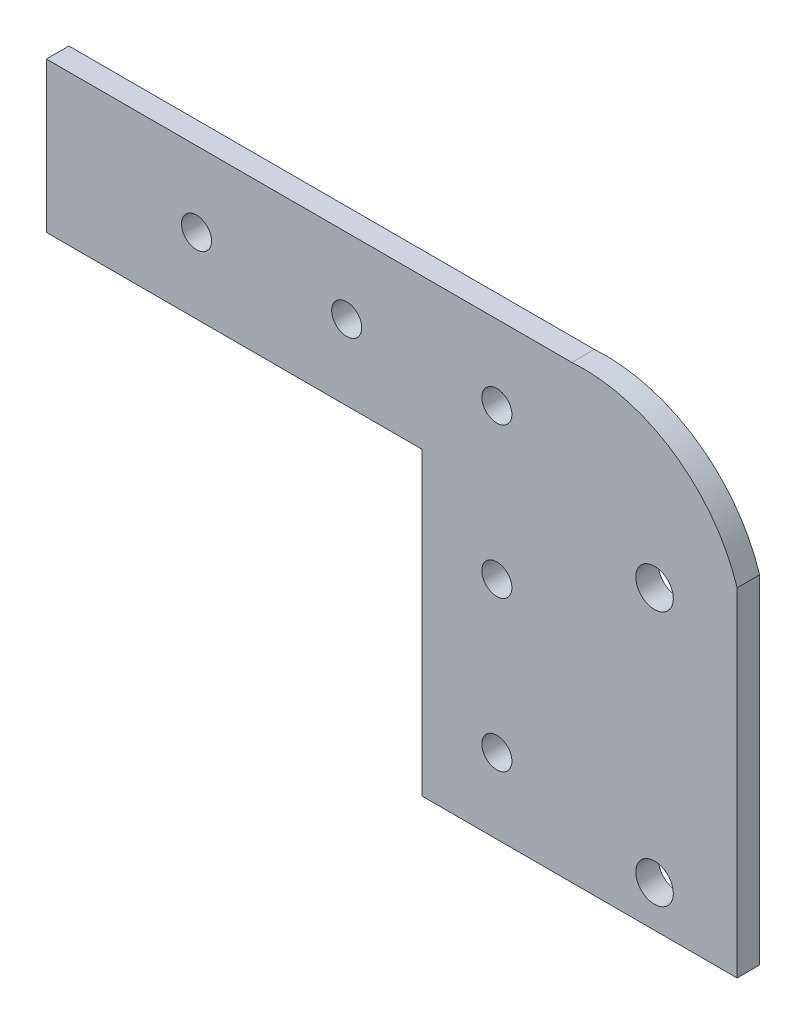
ISO-10303-21;
HEADER;
FILE_DESCRIPTION(('STEP AP214'),'2;1');
FILE_NAME('part.step','',(''),(''),'','','');
FILE_SCHEMA(('AUTOMOTIVE_DESIGN { 1 0 10303 214 1 1 1 1 }'));
ENDSEC;
DATA;
#1=APPLICATION_CONTEXT('core data for automotive mechanical design processes');
#2=APPLICATION_PROTOCOL_DEFINITION('international standard','automotive_design',2000,#1);
#3=PRODUCT_CONTEXT('',#1,'mechanical');
#4=PRODUCT('Part','Part','',(#3));
#5=PRODUCT_RELATED_PRODUCT_CATEGORY('part','',(#4));
#6=PRODUCT_DEFINITION_FORMATION('','',#4);
#7=PRODUCT_DEFINITION_CONTEXT('part definition',#1,'design');
#8=PRODUCT_DEFINITION('design','',#6,#7);
#9=PRODUCT_DEFINITION_SHAPE('','',#8);
#10=(LENGTH_UNIT() NAMED_UNIT(*) SI_UNIT(.MILLI.,.METRE.));
#11=(NAMED_UNIT(*) PLANE_ANGLE_UNIT() SI_UNIT($,.RADIAN.));
#12=(NAMED_UNIT(*) SI_UNIT($,.STERADIAN.) SOLID_ANGLE_UNIT());
#13=UNCERTAINTY_MEASURE_WITH_UNIT(LENGTH_MEASURE(1.E-05),#10,'distance_accuracy_value','');
#14=(GEOMETRIC_REPRESENTATION_CONTEXT(3) GLOBAL_UNCERTAINTY_ASSIGNED_CONTEXT((#13)) GLOBAL_UNIT_ASSIGNED_CONTEXT((#10,
#11,#12)) REPRESENTATION_CONTEXT('',''));
#15=CARTESIAN_POINT('',(0.,0.,0.));
#16=DIRECTION('',(0.,0.,1.));
#17=DIRECTION('',(1.,0.,0.));
#18=AXIS2_PLACEMENT_3D('',#15,#16,#17);
#19=CARTESIAN_POINT('',(0.,-10.,3.));
#20=DIRECTION('',(0.,1.,0.));
#21=DIRECTION('',(-1.,0.,0.));
#22=AXIS2_PLACEMENT_3D('',#19,#20,#21);
#23=PLANE('',#22);
#24=DIRECTION('',(1.,0.,0.));
#25=VECTOR('',#24,1.);
#26=CARTESIAN_POINT('',(0.,-10.,0.));
#27=LINE('',#26,#25);
#28=CARTESIAN_POINT('',(-80.,-10.,0.));
#29=VERTEX_POINT('',#28);
#30=CARTESIAN_POINT('',(-9.99999999999999,-10.,0.));
#31=VERTEX_POINT('',#30);
#32=EDGE_CURVE('E143',#29,#31,#27,.T.);
#33=ORIENTED_EDGE('',*,*,#32,.F.);
#34=DIRECTION('',(0.,0.,-1.));
#35=VECTOR('',#34,1.);
#36=CARTESIAN_POINT('',(-80.,-10.,3.));
#37=LINE('',#36,#35);
#38=CARTESIAN_POINT('',(-80.,-10.,3.));
#39=VERTEX_POINT('',#38);
#40=EDGE_CURVE('E50',#39,#29,#37,.T.);
#41=ORIENTED_EDGE('',*,*,#40,.F.);
#42=DIRECTION('',(1.,0.,0.));
#43=VECTOR('',#42,1.);
#44=CARTESIAN_POINT('',(0.,-10.,3.));
#45=LINE('',#44,#43);
#46=CARTESIAN_POINT('',(-9.99999999999999,-10.,3.));
#47=VERTEX_POINT('',#46);
#48=EDGE_CURVE('E213',#39,#47,#45,.T.);
#49=ORIENTED_EDGE('',*,*,#48,.T.);
#50=DIRECTION('',(0.,0.,-1.));
#51=VECTOR('',#50,1.);
#52=CARTESIAN_POINT('',(-9.99999999999999,-10.,3.));
#53=LINE('',#52,#51);
#54=EDGE_CURVE('E11',#47,#31,#53,.T.);
#55=ORIENTED_EDGE('',*,*,#54,.T.);
#56=EDGE_LOOP('',(#33,#41,#49,#55));
#57=FACE_BOUND('',#56,.T.);
#58=ADVANCED_FACE('F41',(#57),#23,.T.);
#59=CARTESIAN_POINT('',(-80.,0.,3.));
#60=DIRECTION('',(-1.,0.,0.));
#61=DIRECTION('',(0.,-1.,0.));
#62=AXIS2_PLACEMENT_3D('',#59,#60,#61);
#63=PLANE('',#62);
#64=DIRECTION('',(0.,1.,0.));
#65=VECTOR('',#64,1.);
#66=CARTESIAN_POINT('',(-80.,0.,0.));
#67=LINE('',#66,#65);
#68=CARTESIAN_POINT('',(-80.,-30.,0.));
#69=VERTEX_POINT('',#68);
#70=EDGE_CURVE('E146',#69,#29,#67,.T.);
#71=ORIENTED_EDGE('',*,*,#70,.F.);
#72=DIRECTION('',(0.,0.,-1.));
#73=VECTOR('',#72,1.);
#74=CARTESIAN_POINT('',(-80.,-30.,3.));
#75=LINE('',#74,#73);
#76=CARTESIAN_POINT('',(-80.,-30.,3.));
#77=VERTEX_POINT('',#76);
#78=EDGE_CURVE('E115',#77,#69,#75,.T.);
#79=ORIENTED_EDGE('',*,*,#78,.F.);
#80=DIRECTION('',(0.,1.,0.));
#81=VECTOR('',#80,1.);
#82=CARTESIAN_POINT('',(-80.,0.,3.));
#83=LINE('',#82,#81);
#84=EDGE_CURVE('E126',#77,#39,#83,.T.);
#85=ORIENTED_EDGE('',*,*,#84,.T.);
#86=ORIENTED_EDGE('',*,*,#40,.T.);
#87=EDGE_LOOP('',(#71,#79,#85,#86));
#88=FACE_BOUND('',#87,.T.);
#89=ADVANCED_FACE('F166',(#88),#63,.T.);
#90=CARTESIAN_POINT('',(0.,-30.,3.));
#91=DIRECTION('',(0.,-1.,0.));
#92=DIRECTION('',(1.,0.,0.));
#93=AXIS2_PLACEMENT_3D('',#90,#91,#92);
#94=PLANE('',#93);
#95=DIRECTION('',(-1.,0.,0.));
#96=VECTOR('',#95,1.);
#97=CARTESIAN_POINT('',(0.,-30.,0.));
#98=LINE('',#97,#96);
#99=CARTESIAN_POINT('',(-30.,-30.,0.));
#100=VERTEX_POINT('',#99);
#101=EDGE_CURVE('E110',#100,#69,#98,.T.);
#102=ORIENTED_EDGE('',*,*,#101,.F.);
#103=DIRECTION('',(0.,0.,-1.));
#104=VECTOR('',#103,1.);
#105=CARTESIAN_POINT('',(-30.,-30.,3.));
#106=LINE('',#105,#104);
#107=CARTESIAN_POINT('',(-30.,-30.,3.));
#108=VERTEX_POINT('',#107);
#109=EDGE_CURVE('E105',#108,#100,#106,.T.);
#110=ORIENTED_EDGE('',*,*,#109,.F.);
#111=DIRECTION('',(-1.,0.,0.));
#112=VECTOR('',#111,1.);
#113=CARTESIAN_POINT('',(0.,-30.,3.));
#114=LINE('',#113,#112);
#115=EDGE_CURVE('E108',#108,#77,#114,.T.);
#116=ORIENTED_EDGE('',*,*,#115,.T.);
#117=ORIENTED_EDGE('',*,*,#78,.T.);
#118=EDGE_LOOP('',(#102,#110,#116,#117));
#119=FACE_BOUND('',#118,.T.);
#120=ADVANCED_FACE('F107',(#119),#94,.T.);
#121=CARTESIAN_POINT('',(-30.,0.,3.));
#122=DIRECTION('',(-1.,0.,0.));
#123=DIRECTION('',(0.,0.,1.));
#124=AXIS2_PLACEMENT_3D('',#121,#122,#123);
#125=PLANE('',#124);
#126=DIRECTION('',(0.,1.,0.));
#127=VECTOR('',#126,1.);
#128=CARTESIAN_POINT('',(-30.,0.,0.));
#129=LINE('',#128,#127);
#130=CARTESIAN_POINT('',(-30.,-70.,0.));
#131=VERTEX_POINT('',#130);
#132=EDGE_CURVE('E150',#131,#100,#129,.T.);
#133=ORIENTED_EDGE('',*,*,#132,.F.);
#134=DIRECTION('',(0.,0.,-1.));
#135=VECTOR('',#134,1.);
#136=CARTESIAN_POINT('',(-30.,-70.,3.));
#137=LINE('',#136,#135);
#138=CARTESIAN_POINT('',(-30.,-70.,3.));
#139=VERTEX_POINT('',#138);
#140=EDGE_CURVE('E116',#139,#131,#137,.T.);
#141=ORIENTED_EDGE('',*,*,#140,.F.);
#142=DIRECTION('',(0.,1.,0.));
#143=VECTOR('',#142,1.);
#144=CARTESIAN_POINT('',(-30.,0.,3.));
#145=LINE('',#144,#143);
#146=EDGE_CURVE('E124',#139,#108,#145,.T.);
#147=ORIENTED_EDGE('',*,*,#146,.T.);
#148=ORIENTED_EDGE('',*,*,#109,.T.);
#149=EDGE_LOOP('',(#133,#141,#147,#148));
#150=FACE_BOUND('',#149,.T.);
#151=ADVANCED_FACE('F128',(#150),#125,.T.);
#152=CARTESIAN_POINT('',(0.,-70.,3.));
#153=DIRECTION('',(0.,1.,0.));
#154=DIRECTION('',(-1.,0.,0.));
#155=AXIS2_PLACEMENT_3D('',#152,#153,#154);
#156=PLANE('',#155);
#157=DIRECTION('',(1.,0.,0.));
#158=VECTOR('',#157,1.);
#159=CARTESIAN_POINT('',(0.,-70.,0.));
#160=LINE('',#159,#158);
#161=CARTESIAN_POINT('',(12.,-70.,0.));
#162=VERTEX_POINT('',#161);
#163=EDGE_CURVE('E152',#131,#162,#160,.T.);
#164=ORIENTED_EDGE('',*,*,#163,.T.);
#165=DIRECTION('',(0.,0.,-1.));
#166=VECTOR('',#165,1.);
#167=CARTESIAN_POINT('',(12.,-70.,3.));
#168=LINE('',#167,#166);
#169=CARTESIAN_POINT('',(12.,-70.,3.));
#170=VERTEX_POINT('',#169);
#171=EDGE_CURVE('E161',#170,#162,#168,.T.);
#172=ORIENTED_EDGE('',*,*,#171,.F.);
#173=DIRECTION('',(1.,0.,0.));
#174=VECTOR('',#173,1.);
#175=CARTESIAN_POINT('',(0.,-70.,3.));
#176=LINE('',#175,#174);
#177=EDGE_CURVE('E130',#139,#170,#176,.T.);
#178=ORIENTED_EDGE('',*,*,#177,.F.);
#179=ORIENTED_EDGE('',*,*,#140,.T.);
#180=EDGE_LOOP('',(#164,#172,#178,#179));
#181=FACE_BOUND('',#180,.T.);
#182=ADVANCED_FACE('F172',(#181),#156,.F.);
#183=CARTESIAN_POINT('',(12.,0.,3.));
#184=DIRECTION('',(-1.,0.,0.));
#185=DIRECTION('',(0.,-1.,0.));
#186=AXIS2_PLACEMENT_3D('',#183,#184,#185);
#187=PLANE('',#186);
#188=DIRECTION('',(0.,1.,0.));
#189=VECTOR('',#188,1.);
#190=CARTESIAN_POINT('',(12.,0.,0.));
#191=LINE('',#190,#189);
#192=CARTESIAN_POINT('',(12.,-25.,0.));
#193=VERTEX_POINT('',#192);
#194=EDGE_CURVE('E83',#162,#193,#191,.T.);
#195=ORIENTED_EDGE('',*,*,#194,.T.);
#196=DIRECTION('',(0.,0.,-1.));
#197=VECTOR('',#196,1.);
#198=CARTESIAN_POINT('',(12.,-25.,3.));
#199=LINE('',#198,#197);
#200=CARTESIAN_POINT('',(12.,-25.,3.));
#201=VERTEX_POINT('',#200);
#202=EDGE_CURVE('E139',#201,#193,#199,.T.);
#203=ORIENTED_EDGE('',*,*,#202,.F.);
#204=DIRECTION('',(0.,1.,0.));
#205=VECTOR('',#204,1.);
#206=CARTESIAN_POINT('',(12.,0.,3.));
#207=LINE('',#206,#205);
#208=EDGE_CURVE('E58',#170,#201,#207,.T.);
#209=ORIENTED_EDGE('',*,*,#208,.F.);
#210=ORIENTED_EDGE('',*,*,#171,.T.);
#211=EDGE_LOOP('',(#195,#203,#209,#210));
#212=FACE_BOUND('',#211,.T.);
#213=ADVANCED_FACE('F176',(#212),#187,.F.);
#214=CARTESIAN_POINT('',(0.999999999999996,-30.5,3.));
#215=DIRECTION('',(0.,0.,-1.));
#216=DIRECTION('',(-1.,0.,0.));
#217=AXIS2_PLACEMENT_3D('',#214,#215,#216);
#218=CYLINDRICAL_SURFACE('',#217,2.5);
#219=CARTESIAN_POINT('',(0.999999999999996,-30.5,3.));
#220=DIRECTION('',(0.,0.,1.));
#221=DIRECTION('',(1.,0.,0.));
#222=AXIS2_PLACEMENT_3D('',#219,#220,#221);
#223=CIRCLE('',#222,2.5);
#224=CARTESIAN_POINT('',(3.5,-30.5,3.));
#225=VERTEX_POINT('',#224);
#226=EDGE_CURVE('E159',#225,#225,#223,.T.);
#227=ORIENTED_EDGE('',*,*,#226,.T.);
#228=EDGE_LOOP('',(#227));
#229=FACE_BOUND('',#228,.T.);
#230=CARTESIAN_POINT('',(0.999999999999996,-30.5,0.));
#231=DIRECTION('',(0.,0.,1.));
#232=DIRECTION('',(1.,0.,0.));
#233=AXIS2_PLACEMENT_3D('',#230,#231,#232);
#234=CIRCLE('',#233,2.5);
#235=CARTESIAN_POINT('',(3.5,-30.5,0.));
#236=VERTEX_POINT('',#235);
#237=EDGE_CURVE('E140',#236,#236,#234,.T.);
#238=ORIENTED_EDGE('',*,*,#237,.F.);
#239=EDGE_LOOP('',(#238));
#240=FACE_BOUND('',#239,.T.);
#241=ADVANCED_FACE('F43',(#229,#240),#218,.F.);
#242=CARTESIAN_POINT('',(1.,-64.5,3.));
#243=DIRECTION('',(0.,0.,-1.));
#244=DIRECTION('',(-1.,0.,0.));
#245=AXIS2_PLACEMENT_3D('',#242,#243,#244);
#246=CYLINDRICAL_SURFACE('',#245,2.5);
#247=CARTESIAN_POINT('',(1.,-64.5,3.));
#248=DIRECTION('',(0.,0.,1.));
#249=DIRECTION('',(1.,0.,0.));
#250=AXIS2_PLACEMENT_3D('',#247,#248,#249);
#251=CIRCLE('',#250,2.5);
#252=CARTESIAN_POINT('',(3.5,-64.5,3.));
#253=VERTEX_POINT('',#252);
#254=EDGE_CURVE('E136',#253,#253,#251,.T.);
#255=ORIENTED_EDGE('',*,*,#254,.T.);
#256=EDGE_LOOP('',(#255));
#257=FACE_BOUND('',#256,.T.);
#258=CARTESIAN_POINT('',(1.,-64.5,0.));
#259=DIRECTION('',(0.,0.,1.));
#260=DIRECTION('',(1.,0.,0.));
#261=AXIS2_PLACEMENT_3D('',#258,#259,#260);
#262=CIRCLE('',#261,2.5);
#263=CARTESIAN_POINT('',(3.5,-64.5,0.));
#264=VERTEX_POINT('',#263);
#265=EDGE_CURVE('E156',#264,#264,#262,.T.);
#266=ORIENTED_EDGE('',*,*,#265,.F.);
#267=EDGE_LOOP('',(#266));
#268=FACE_BOUND('',#267,.T.);
#269=ADVANCED_FACE('F221',(#257,#268),#246,.F.);
#270=CARTESIAN_POINT('',(0.,0.,3.));
#271=DIRECTION('',(0.,0.,1.));
#272=DIRECTION('',(1.,0.,0.));
#273=AXIS2_PLACEMENT_3D('',#270,#271,#272);
#274=PLANE('',#273);
#275=CARTESIAN_POINT('',(-8.52702702702704,-31.472972972973,3.));
#276=DIRECTION('',(0.,0.,1.));
#277=DIRECTION('',(1.,0.,0.));
#278=AXIS2_PLACEMENT_3D('',#275,#276,#277);
#279=CIRCLE('',#278,21.5234341515739);
#280=EDGE_CURVE('E175',#201,#47,#279,.T.);
#281=ORIENTED_EDGE('',*,*,#280,.T.);
#282=ORIENTED_EDGE('',*,*,#48,.F.);
#283=ORIENTED_EDGE('',*,*,#84,.F.);
#284=ORIENTED_EDGE('',*,*,#115,.F.);
#285=ORIENTED_EDGE('',*,*,#146,.F.);
#286=ORIENTED_EDGE('',*,*,#177,.T.);
#287=ORIENTED_EDGE('',*,*,#208,.T.);
#288=EDGE_LOOP('',(#281,#282,#283,#284,#285,#286,#287));
#289=FACE_BOUND('',#288,.T.);
#290=CARTESIAN_POINT('',(-39.9999999999932,-20.0000000000012,3.));
#291=DIRECTION('',(0.,0.,1.));
#292=DIRECTION('',(1.,0.,0.));
#293=AXIS2_PLACEMENT_3D('',#290,#291,#292);
#294=CIRCLE('',#293,2.);
#295=CARTESIAN_POINT('',(-37.9999999999932,-20.0000000000012,3.));
#296=VERTEX_POINT('',#295);
#297=EDGE_CURVE('E144',#296,#296,#294,.T.);
#298=ORIENTED_EDGE('',*,*,#297,.F.);
#299=EDGE_LOOP('',(#298));
#300=FACE_BOUND('',#299,.T.);
#301=CARTESIAN_POINT('',(-19.9999999999932,-20.0000000000012,3.));
#302=DIRECTION('',(0.,0.,1.));
#303=DIRECTION('',(1.,0.,0.));
#304=AXIS2_PLACEMENT_3D('',#301,#302,#303);
#305=CIRCLE('',#304,2.00000000000001);
#306=CARTESIAN_POINT('',(-17.9999999999932,-20.0000000000012,3.));
#307=VERTEX_POINT('',#306);
#308=EDGE_CURVE('E206',#307,#307,#305,.T.);
#309=ORIENTED_EDGE('',*,*,#308,.F.);
#310=EDGE_LOOP('',(#309));
#311=FACE_BOUND('',#310,.T.);
#312=CARTESIAN_POINT('',(-19.9999999999932,-60.0000000000012,3.));
#313=DIRECTION('',(0.,0.,1.));
#314=DIRECTION('',(1.,0.,0.));
#315=AXIS2_PLACEMENT_3D('',#312,#313,#314);
#316=CIRCLE('',#315,2.00000000000001);
#317=CARTESIAN_POINT('',(-17.9999999999932,-60.0000000000012,3.));
#318=VERTEX_POINT('',#317);
#319=EDGE_CURVE('E203',#318,#318,#316,.T.);
#320=ORIENTED_EDGE('',*,*,#319,.F.);
#321=EDGE_LOOP('',(#320));
#322=FACE_BOUND('',#321,.T.);
#323=CARTESIAN_POINT('',(-59.9999999999932,-20.0000000000012,3.));
#324=DIRECTION('',(0.,0.,1.));
#325=DIRECTION('',(1.,0.,0.));
#326=AXIS2_PLACEMENT_3D('',#323,#324,#325);
#327=CIRCLE('',#326,2.);
#328=CARTESIAN_POINT('',(-57.9999999999932,-20.0000000000012,3.));
#329=VERTEX_POINT('',#328);
#330=EDGE_CURVE('E200',#329,#329,#327,.T.);
#331=ORIENTED_EDGE('',*,*,#330,.F.);
#332=EDGE_LOOP('',(#331));
#333=FACE_BOUND('',#332,.T.);
#334=CARTESIAN_POINT('',(-19.9999999999932,-40.0000000000012,3.));
#335=DIRECTION('',(0.,0.,1.));
#336=DIRECTION('',(1.,0.,0.));
#337=AXIS2_PLACEMENT_3D('',#334,#335,#336);
#338=CIRCLE('',#337,2.00000000000001);
#339=CARTESIAN_POINT('',(-17.9999999999932,-40.0000000000012,3.));
#340=VERTEX_POINT('',#339);
#341=EDGE_CURVE('E197',#340,#340,#338,.T.);
#342=ORIENTED_EDGE('',*,*,#341,.F.);
#343=EDGE_LOOP('',(#342));
#344=FACE_BOUND('',#343,.T.);
#345=ORIENTED_EDGE('',*,*,#226,.F.);
#346=EDGE_LOOP('',(#345));
#347=FACE_BOUND('',#346,.T.);
#348=ORIENTED_EDGE('',*,*,#254,.F.);
#349=EDGE_LOOP('',(#348));
#350=FACE_BOUND('',#349,.T.);
#351=ADVANCED_FACE('F122',(#289,#300,#311,#322,#333,#344,#347,#350),#274,.T.);
#352=CARTESIAN_POINT('',(0.,0.,0.));
#353=DIRECTION('',(0.,0.,1.));
#354=DIRECTION('',(1.,0.,0.));
#355=AXIS2_PLACEMENT_3D('',#352,#353,#354);
#356=PLANE('',#355);
#357=ORIENTED_EDGE('',*,*,#32,.T.);
#358=CARTESIAN_POINT('',(-8.52702702702704,-31.472972972973,0.));
#359=DIRECTION('',(0.,0.,1.));
#360=DIRECTION('',(1.,0.,0.));
#361=AXIS2_PLACEMENT_3D('',#358,#359,#360);
#362=CIRCLE('',#361,21.5234341515739);
#363=EDGE_CURVE('E87',#193,#31,#362,.T.);
#364=ORIENTED_EDGE('',*,*,#363,.F.);
#365=ORIENTED_EDGE('',*,*,#194,.F.);
#366=ORIENTED_EDGE('',*,*,#163,.F.);
#367=ORIENTED_EDGE('',*,*,#132,.T.);
#368=ORIENTED_EDGE('',*,*,#101,.T.);
#369=ORIENTED_EDGE('',*,*,#70,.T.);
#370=EDGE_LOOP('',(#357,#364,#365,#366,#367,#368,#369));
#371=FACE_BOUND('',#370,.T.);
#372=CARTESIAN_POINT('',(-39.9999999999932,-20.0000000000012,0.));
#373=DIRECTION('',(0.,0.,-1.));
#374=DIRECTION('',(-1.,0.,0.));
#375=AXIS2_PLACEMENT_3D('',#372,#373,#374);
#376=CIRCLE('',#375,2.);
#377=CARTESIAN_POINT('',(-41.9999999999932,-20.0000000000012,0.));
#378=VERTEX_POINT('',#377);
#379=EDGE_CURVE('E189',#378,#378,#376,.T.);
#380=ORIENTED_EDGE('',*,*,#379,.F.);
#381=EDGE_LOOP('',(#380));
#382=FACE_BOUND('',#381,.T.);
#383=CARTESIAN_POINT('',(-19.9999999999932,-20.0000000000012,0.));
#384=DIRECTION('',(0.,0.,-1.));
#385=DIRECTION('',(-1.,0.,0.));
#386=AXIS2_PLACEMENT_3D('',#383,#384,#385);
#387=CIRCLE('',#386,2.00000000000001);
#388=CARTESIAN_POINT('',(-21.9999999999932,-20.0000000000012,0.));
#389=VERTEX_POINT('',#388);
#390=EDGE_CURVE('E186',#389,#389,#387,.T.);
#391=ORIENTED_EDGE('',*,*,#390,.F.);
#392=EDGE_LOOP('',(#391));
#393=FACE_BOUND('',#392,.T.);
#394=CARTESIAN_POINT('',(-19.9999999999932,-60.0000000000012,0.));
#395=DIRECTION('',(0.,0.,-1.));
#396=DIRECTION('',(-1.,0.,0.));
#397=AXIS2_PLACEMENT_3D('',#394,#395,#396);
#398=CIRCLE('',#397,2.00000000000001);
#399=CARTESIAN_POINT('',(-21.9999999999932,-60.0000000000012,0.));
#400=VERTEX_POINT('',#399);
#401=EDGE_CURVE('E183',#400,#400,#398,.T.);
#402=ORIENTED_EDGE('',*,*,#401,.F.);
#403=EDGE_LOOP('',(#402));
#404=FACE_BOUND('',#403,.T.);
#405=CARTESIAN_POINT('',(-59.9999999999932,-20.0000000000012,0.));
#406=DIRECTION('',(0.,0.,-1.));
#407=DIRECTION('',(-1.,0.,0.));
#408=AXIS2_PLACEMENT_3D('',#405,#406,#407);
#409=CIRCLE('',#408,2.);
#410=CARTESIAN_POINT('',(-61.9999999999932,-20.0000000000012,0.));
#411=VERTEX_POINT('',#410);
#412=EDGE_CURVE('E180',#411,#411,#409,.T.);
#413=ORIENTED_EDGE('',*,*,#412,.F.);
#414=EDGE_LOOP('',(#413));
#415=FACE_BOUND('',#414,.T.);
#416=CARTESIAN_POINT('',(-19.9999999999932,-40.0000000000012,0.));
#417=DIRECTION('',(0.,0.,-1.));
#418=DIRECTION('',(-1.,0.,0.));
#419=AXIS2_PLACEMENT_3D('',#416,#417,#418);
#420=CIRCLE('',#419,2.00000000000001);
#421=CARTESIAN_POINT('',(-21.9999999999932,-40.0000000000012,0.));
#422=VERTEX_POINT('',#421);
#423=EDGE_CURVE('E192',#422,#422,#420,.T.);
#424=ORIENTED_EDGE('',*,*,#423,.F.);
#425=EDGE_LOOP('',(#424));
#426=FACE_BOUND('',#425,.T.);
#427=ORIENTED_EDGE('',*,*,#237,.T.);
#428=EDGE_LOOP('',(#427));
#429=FACE_BOUND('',#428,.T.);
#430=ORIENTED_EDGE('',*,*,#265,.T.);
#431=EDGE_LOOP('',(#430));
#432=FACE_BOUND('',#431,.T.);
#433=ADVANCED_FACE('F168',(#371,#382,#393,#404,#415,#426,#429,#432),#356,.F.);
#434=CARTESIAN_POINT('',(-19.9999999999932,-40.0000000000012,10.));
#435=DIRECTION('',(0.,0.,-1.));
#436=DIRECTION('',(-1.,0.,0.));
#437=AXIS2_PLACEMENT_3D('',#434,#435,#436);
#438=CYLINDRICAL_SURFACE('',#437,2.00000000000001);
#439=ORIENTED_EDGE('',*,*,#341,.T.);
#440=EDGE_LOOP('',(#439));
#441=FACE_BOUND('',#440,.T.);
#442=ORIENTED_EDGE('',*,*,#423,.T.);
#443=EDGE_LOOP('',(#442));
#444=FACE_BOUND('',#443,.T.);
#445=ADVANCED_FACE('F231',(#441,#444),#438,.F.);
#446=CARTESIAN_POINT('',(-59.9999999999932,-20.0000000000012,10.));
#447=DIRECTION('',(0.,0.,-1.));
#448=DIRECTION('',(-1.,0.,0.));
#449=AXIS2_PLACEMENT_3D('',#446,#447,#448);
#450=CYLINDRICAL_SURFACE('',#449,2.);
#451=ORIENTED_EDGE('',*,*,#330,.T.);
#452=EDGE_LOOP('',(#451));
#453=FACE_BOUND('',#452,.T.);
#454=ORIENTED_EDGE('',*,*,#412,.T.);
#455=EDGE_LOOP('',(#454));
#456=FACE_BOUND('',#455,.T.);
#457=ADVANCED_FACE('F237',(#453,#456),#450,.F.);
#458=CARTESIAN_POINT('',(-19.9999999999932,-60.0000000000012,10.));
#459=DIRECTION('',(0.,0.,-1.));
#460=DIRECTION('',(-1.,0.,0.));
#461=AXIS2_PLACEMENT_3D('',#458,#459,#460);
#462=CYLINDRICAL_SURFACE('',#461,2.00000000000001);
#463=ORIENTED_EDGE('',*,*,#319,.T.);
#464=EDGE_LOOP('',(#463));
#465=FACE_BOUND('',#464,.T.);
#466=ORIENTED_EDGE('',*,*,#401,.T.);
#467=EDGE_LOOP('',(#466));
#468=FACE_BOUND('',#467,.T.);
#469=ADVANCED_FACE('F280',(#465,#468),#462,.F.);
#470=CARTESIAN_POINT('',(-19.9999999999932,-20.0000000000012,10.));
#471=DIRECTION('',(0.,0.,-1.));
#472=DIRECTION('',(-1.,0.,0.));
#473=AXIS2_PLACEMENT_3D('',#470,#471,#472);
#474=CYLINDRICAL_SURFACE('',#473,2.00000000000001);
#475=ORIENTED_EDGE('',*,*,#308,.T.);
#476=EDGE_LOOP('',(#475));
#477=FACE_BOUND('',#476,.T.);
#478=ORIENTED_EDGE('',*,*,#390,.T.);
#479=EDGE_LOOP('',(#478));
#480=FACE_BOUND('',#479,.T.);
#481=ADVANCED_FACE('F289',(#477,#480),#474,.F.);
#482=CARTESIAN_POINT('',(-39.9999999999932,-20.0000000000012,10.));
#483=DIRECTION('',(0.,0.,-1.));
#484=DIRECTION('',(-1.,0.,0.));
#485=AXIS2_PLACEMENT_3D('',#482,#483,#484);
#486=CYLINDRICAL_SURFACE('',#485,2.);
#487=ORIENTED_EDGE('',*,*,#297,.T.);
#488=EDGE_LOOP('',(#487));
#489=FACE_BOUND('',#488,.T.);
#490=ORIENTED_EDGE('',*,*,#379,.T.);
#491=EDGE_LOOP('',(#490));
#492=FACE_BOUND('',#491,.T.);
#493=ADVANCED_FACE('F297',(#489,#492),#486,.F.);
#494=CARTESIAN_POINT('',(-8.52702702702704,-31.472972972973,0.));
#495=DIRECTION('',(0.,0.,1.));
#496=DIRECTION('',(1.,0.,0.));
#497=AXIS2_PLACEMENT_3D('',#494,#495,#496);
#498=CYLINDRICAL_SURFACE('',#497,21.5234341515739);
#499=ORIENTED_EDGE('',*,*,#280,.F.);
#500=ORIENTED_EDGE('',*,*,#202,.T.);
#501=ORIENTED_EDGE('',*,*,#363,.T.);
#502=ORIENTED_EDGE('',*,*,#54,.F.);
#503=EDGE_LOOP('',(#499,#500,#501,#502));
#504=FACE_BOUND('',#503,.T.);
#505=ADVANCED_FACE('F178',(#504),#498,.T.);
#506=CLOSED_SHELL('',(#58,#89,#120,#151,#182,#213,#241,#269,#351,#433,#445,#457,#469,#481,#493,#505));
#507=MANIFOLD_SOLID_BREP('B2',#506);
#508=ADVANCED_BREP_SHAPE_REPRESENTATION('',(#18,#507),#14);
#509=SHAPE_DEFINITION_REPRESENTATION(#9,#508);
ENDSEC;
END-ISO-10303-21;
